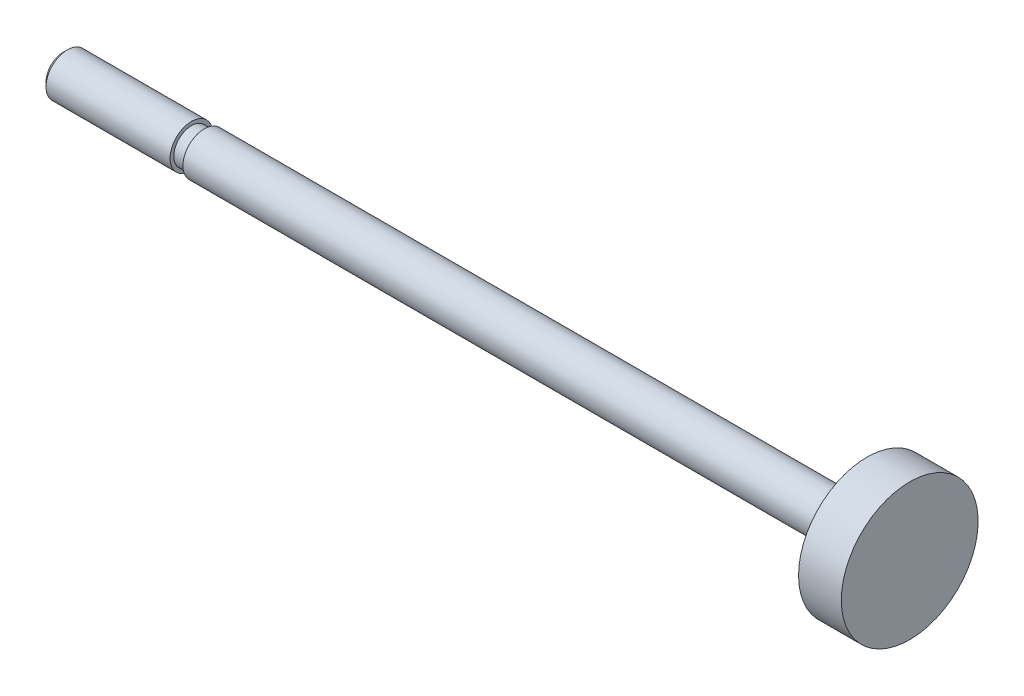
ISO-10303-21;
HEADER;
FILE_DESCRIPTION(('STEP AP214'),'2;1');
FILE_NAME('part.step','',(''),(''),'','','');
FILE_SCHEMA(('AUTOMOTIVE_DESIGN { 1 0 10303 214 1 1 1 1 }'));
ENDSEC;
DATA;
#1=APPLICATION_CONTEXT('core data for automotive mechanical design processes');
#2=APPLICATION_PROTOCOL_DEFINITION('international standard','automotive_design',2000,#1);
#3=PRODUCT_CONTEXT('',#1,'mechanical');
#4=PRODUCT('Part','Part','',(#3));
#5=PRODUCT_RELATED_PRODUCT_CATEGORY('part','',(#4));
#6=PRODUCT_DEFINITION_FORMATION('','',#4);
#7=PRODUCT_DEFINITION_CONTEXT('part definition',#1,'design');
#8=PRODUCT_DEFINITION('design','',#6,#7);
#9=PRODUCT_DEFINITION_SHAPE('','',#8);
#10=(LENGTH_UNIT() NAMED_UNIT(*) SI_UNIT(.MILLI.,.METRE.));
#11=(NAMED_UNIT(*) PLANE_ANGLE_UNIT() SI_UNIT($,.RADIAN.));
#12=(NAMED_UNIT(*) SI_UNIT($,.STERADIAN.) SOLID_ANGLE_UNIT());
#13=UNCERTAINTY_MEASURE_WITH_UNIT(LENGTH_MEASURE(1.E-05),#10,'distance_accuracy_value','');
#14=(GEOMETRIC_REPRESENTATION_CONTEXT(3) GLOBAL_UNCERTAINTY_ASSIGNED_CONTEXT((#13)) GLOBAL_UNIT_ASSIGNED_CONTEXT((#10,
#11,#12)) REPRESENTATION_CONTEXT('',''));
#15=CARTESIAN_POINT('',(0.,0.,0.));
#16=DIRECTION('',(0.,0.,1.));
#17=DIRECTION('',(1.,0.,0.));
#18=AXIS2_PLACEMENT_3D('',#15,#16,#17);
#19=CARTESIAN_POINT('',(0.,0.,0.));
#20=DIRECTION('',(1.,0.,0.));
#21=DIRECTION('',(0.,0.,-1.));
#22=AXIS2_PLACEMENT_3D('',#19,#20,#21);
#23=PLANE('',#22);
#24=CARTESIAN_POINT('',(0.,0.,0.));
#25=DIRECTION('',(-1.,0.,0.));
#26=DIRECTION('',(0.,0.,1.));
#27=AXIS2_PLACEMENT_3D('',#24,#25,#26);
#28=CIRCLE('',#27,2.0095);
#29=CARTESIAN_POINT('',(0.,0.,2.0095));
#30=VERTEX_POINT('',#29);
#31=EDGE_CURVE('E10',#30,#30,#28,.T.);
#32=ORIENTED_EDGE('',*,*,#31,.T.);
#33=EDGE_LOOP('',(#32));
#34=FACE_BOUND('',#33,.T.);
#35=ADVANCED_FACE('F33',(#34),#23,.F.);
#36=CARTESIAN_POINT('',(0.490500000000005,0.,0.));
#37=DIRECTION('',(1.,0.,0.));
#38=DIRECTION('',(0.,0.,-1.));
#39=AXIS2_PLACEMENT_3D('',#36,#37,#38);
#40=CONICAL_SURFACE('',#39,2.5,0.785398163397443);
#41=ORIENTED_EDGE('',*,*,#31,.F.);
#42=EDGE_LOOP('',(#41));
#43=FACE_BOUND('',#42,.T.);
#44=CARTESIAN_POINT('',(0.490500000000005,0.,0.));
#45=DIRECTION('',(-1.,0.,0.));
#46=DIRECTION('',(0.,0.,1.));
#47=AXIS2_PLACEMENT_3D('',#44,#45,#46);
#48=CIRCLE('',#47,2.5);
#49=CARTESIAN_POINT('',(0.490500000000005,0.,2.5));
#50=VERTEX_POINT('',#49);
#51=EDGE_CURVE('E39',#50,#50,#48,.T.);
#52=ORIENTED_EDGE('',*,*,#51,.T.);
#53=EDGE_LOOP('',(#52));
#54=FACE_BOUND('',#53,.T.);
#55=ADVANCED_FACE('F80',(#43,#54),#40,.T.);
#56=CARTESIAN_POINT('',(99.,0.,0.));
#57=DIRECTION('',(-1.,0.,0.));
#58=DIRECTION('',(0.,0.,1.));
#59=AXIS2_PLACEMENT_3D('',#56,#57,#58);
#60=CYLINDRICAL_SURFACE('',#59,2.5);
#61=ORIENTED_EDGE('',*,*,#51,.F.);
#62=EDGE_LOOP('',(#61));
#63=FACE_BOUND('',#62,.T.);
#64=CARTESIAN_POINT('',(15.,0.,0.));
#65=DIRECTION('',(-1.,0.,0.));
#66=DIRECTION('',(0.,0.,1.));
#67=AXIS2_PLACEMENT_3D('',#64,#65,#66);
#68=CIRCLE('',#67,2.5);
#69=CARTESIAN_POINT('',(15.,0.,2.5));
#70=VERTEX_POINT('',#69);
#71=EDGE_CURVE('E43',#70,#70,#68,.T.);
#72=ORIENTED_EDGE('',*,*,#71,.T.);
#73=EDGE_LOOP('',(#72));
#74=FACE_BOUND('',#73,.T.);
#75=ADVANCED_FACE('F84',(#63,#74),#60,.T.);
#76=CARTESIAN_POINT('',(15.,2.5,0.));
#77=DIRECTION('',(-1.,0.,0.));
#78=DIRECTION('',(0.,0.,1.));
#79=AXIS2_PLACEMENT_3D('',#76,#77,#78);
#80=PLANE('',#79);
#81=ORIENTED_EDGE('',*,*,#71,.F.);
#82=EDGE_LOOP('',(#81));
#83=FACE_BOUND('',#82,.T.);
#84=CARTESIAN_POINT('',(15.,0.,0.));
#85=DIRECTION('',(-1.,0.,0.));
#86=DIRECTION('',(0.,0.,1.));
#87=AXIS2_PLACEMENT_3D('',#84,#85,#86);
#88=CIRCLE('',#87,2.067);
#89=CARTESIAN_POINT('',(15.,0.,2.067));
#90=VERTEX_POINT('',#89);
#91=EDGE_CURVE('E47',#90,#90,#88,.T.);
#92=ORIENTED_EDGE('',*,*,#91,.T.);
#93=EDGE_LOOP('',(#92));
#94=FACE_BOUND('',#93,.T.);
#95=ADVANCED_FACE('F89',(#83,#94),#80,.F.);
#96=CARTESIAN_POINT('',(99.,0.,0.));
#97=DIRECTION('',(-1.,0.,0.));
#98=DIRECTION('',(0.,0.,1.));
#99=AXIS2_PLACEMENT_3D('',#96,#97,#98);
#100=CYLINDRICAL_SURFACE('',#99,2.067);
#101=ORIENTED_EDGE('',*,*,#91,.F.);
#102=EDGE_LOOP('',(#101));
#103=FACE_BOUND('',#102,.T.);
#104=CARTESIAN_POINT('',(16.5,0.,0.));
#105=DIRECTION('',(-1.,0.,0.));
#106=DIRECTION('',(0.,0.,1.));
#107=AXIS2_PLACEMENT_3D('',#104,#105,#106);
#108=CIRCLE('',#107,2.067);
#109=CARTESIAN_POINT('',(16.5,0.,2.067));
#110=VERTEX_POINT('',#109);
#111=EDGE_CURVE('E52',#110,#110,#108,.T.);
#112=ORIENTED_EDGE('',*,*,#111,.T.);
#113=EDGE_LOOP('',(#112));
#114=FACE_BOUND('',#113,.T.);
#115=ADVANCED_FACE('F95',(#103,#114),#100,.T.);
#116=CARTESIAN_POINT('',(16.5,2.067,0.));
#117=DIRECTION('',(1.,0.,0.));
#118=DIRECTION('',(0.,0.,-1.));
#119=AXIS2_PLACEMENT_3D('',#116,#117,#118);
#120=PLANE('',#119);
#121=ORIENTED_EDGE('',*,*,#111,.F.);
#122=EDGE_LOOP('',(#121));
#123=FACE_BOUND('',#122,.T.);
#124=CARTESIAN_POINT('',(16.5,0.,0.));
#125=DIRECTION('',(-1.,0.,0.));
#126=DIRECTION('',(0.,0.,1.));
#127=AXIS2_PLACEMENT_3D('',#124,#125,#126);
#128=CIRCLE('',#127,2.5);
#129=CARTESIAN_POINT('',(16.5,0.,2.5));
#130=VERTEX_POINT('',#129);
#131=EDGE_CURVE('E55',#130,#130,#128,.T.);
#132=ORIENTED_EDGE('',*,*,#131,.T.);
#133=EDGE_LOOP('',(#132));
#134=FACE_BOUND('',#133,.T.);
#135=ADVANCED_FACE('F99',(#123,#134),#120,.F.);
#136=CARTESIAN_POINT('',(99.,0.,0.));
#137=DIRECTION('',(-1.,0.,0.));
#138=DIRECTION('',(0.,0.,1.));
#139=AXIS2_PLACEMENT_3D('',#136,#137,#138);
#140=CYLINDRICAL_SURFACE('',#139,2.5);
#141=ORIENTED_EDGE('',*,*,#131,.F.);
#142=EDGE_LOOP('',(#141));
#143=FACE_BOUND('',#142,.T.);
#144=CARTESIAN_POINT('',(94.,0.,0.));
#145=DIRECTION('',(-1.,0.,0.));
#146=DIRECTION('',(0.,0.,1.));
#147=AXIS2_PLACEMENT_3D('',#144,#145,#146);
#148=CIRCLE('',#147,2.5);
#149=CARTESIAN_POINT('',(94.,0.,2.5));
#150=VERTEX_POINT('',#149);
#151=EDGE_CURVE('E58',#150,#150,#148,.T.);
#152=ORIENTED_EDGE('',*,*,#151,.T.);
#153=EDGE_LOOP('',(#152));
#154=FACE_BOUND('',#153,.T.);
#155=ADVANCED_FACE('F103',(#143,#154),#140,.T.);
#156=CARTESIAN_POINT('',(94.,2.5,0.));
#157=DIRECTION('',(1.,0.,0.));
#158=DIRECTION('',(0.,0.,-1.));
#159=AXIS2_PLACEMENT_3D('',#156,#157,#158);
#160=PLANE('',#159);
#161=ORIENTED_EDGE('',*,*,#151,.F.);
#162=EDGE_LOOP('',(#161));
#163=FACE_BOUND('',#162,.T.);
#164=CARTESIAN_POINT('',(94.,0.,0.));
#165=DIRECTION('',(-1.,0.,0.));
#166=DIRECTION('',(0.,0.,1.));
#167=AXIS2_PLACEMENT_3D('',#164,#165,#166);
#168=CIRCLE('',#167,8.);
#169=CARTESIAN_POINT('',(94.,0.,8.));
#170=VERTEX_POINT('',#169);
#171=EDGE_CURVE('E61',#170,#170,#168,.T.);
#172=ORIENTED_EDGE('',*,*,#171,.T.);
#173=EDGE_LOOP('',(#172));
#174=FACE_BOUND('',#173,.T.);
#175=ADVANCED_FACE('F76',(#163,#174),#160,.F.);
#176=CARTESIAN_POINT('',(99.,0.,0.));
#177=DIRECTION('',(-1.,0.,0.));
#178=DIRECTION('',(0.,0.,1.));
#179=AXIS2_PLACEMENT_3D('',#176,#177,#178);
#180=CYLINDRICAL_SURFACE('',#179,8.);
#181=ORIENTED_EDGE('',*,*,#171,.F.);
#182=EDGE_LOOP('',(#181));
#183=FACE_BOUND('',#182,.T.);
#184=CARTESIAN_POINT('',(99.,0.,0.));
#185=DIRECTION('',(-1.,0.,0.));
#186=DIRECTION('',(0.,0.,1.));
#187=AXIS2_PLACEMENT_3D('',#184,#185,#186);
#188=CIRCLE('',#187,8.);
#189=CARTESIAN_POINT('',(99.,0.,8.));
#190=VERTEX_POINT('',#189);
#191=EDGE_CURVE('E64',#190,#190,#188,.T.);
#192=ORIENTED_EDGE('',*,*,#191,.T.);
#193=EDGE_LOOP('',(#192));
#194=FACE_BOUND('',#193,.T.);
#195=ADVANCED_FACE('F68',(#183,#194),#180,.T.);
#196=CARTESIAN_POINT('',(99.,8.,0.));
#197=DIRECTION('',(-1.,0.,0.));
#198=DIRECTION('',(0.,0.,1.));
#199=AXIS2_PLACEMENT_3D('',#196,#197,#198);
#200=PLANE('',#199);
#201=ORIENTED_EDGE('',*,*,#191,.F.);
#202=EDGE_LOOP('',(#201));
#203=FACE_BOUND('',#202,.T.);
#204=ADVANCED_FACE('F70',(#203),#200,.F.);
#205=CLOSED_SHELL('',(#35,#55,#75,#95,#115,#135,#155,#175,#195,#204));
#206=MANIFOLD_SOLID_BREP('B2',#205);
#207=ADVANCED_BREP_SHAPE_REPRESENTATION('',(#18,#206),#14);
#208=SHAPE_DEFINITION_REPRESENTATION(#9,#207);
ENDSEC;
END-ISO-10303-21;
